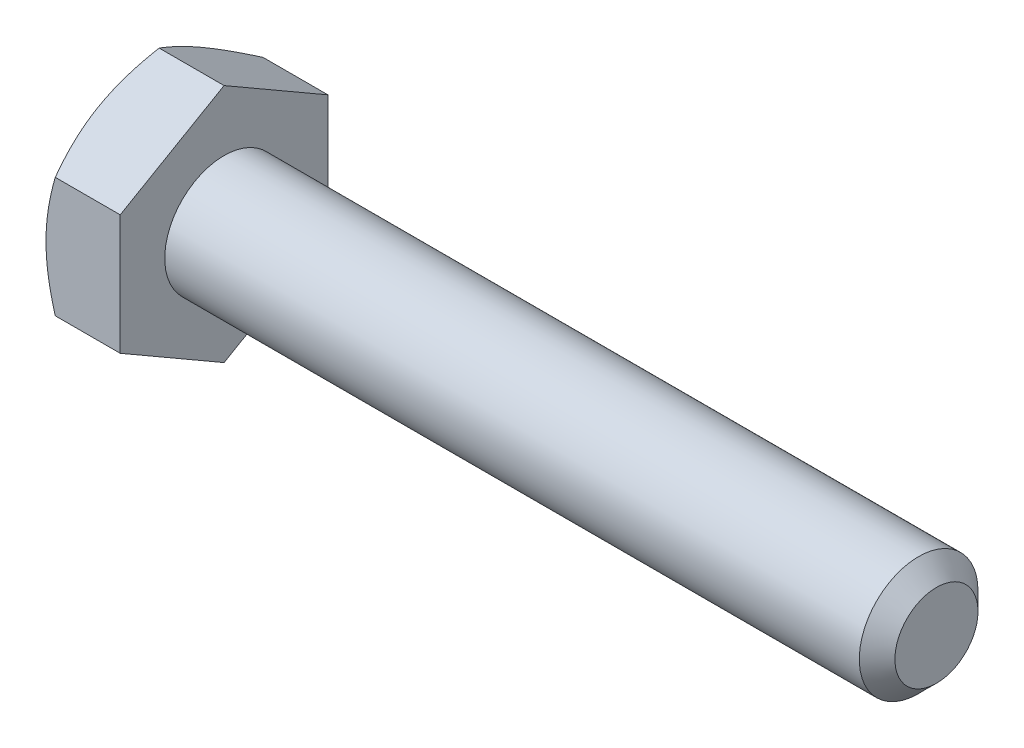
ISO-10303-21;
HEADER;
FILE_DESCRIPTION(('STEP AP214'),'2;1');
FILE_NAME('part.step','',(''),(''),'','','');
FILE_SCHEMA(('AUTOMOTIVE_DESIGN { 1 0 10303 214 1 1 1 1 }'));
ENDSEC;
DATA;
#1=APPLICATION_CONTEXT('core data for automotive mechanical design processes');
#2=APPLICATION_PROTOCOL_DEFINITION('international standard','automotive_design',2000,#1);
#3=PRODUCT_CONTEXT('',#1,'mechanical');
#4=PRODUCT('Part','Part','',(#3));
#5=PRODUCT_RELATED_PRODUCT_CATEGORY('part','',(#4));
#6=PRODUCT_DEFINITION_FORMATION('','',#4);
#7=PRODUCT_DEFINITION_CONTEXT('part definition',#1,'design');
#8=PRODUCT_DEFINITION('design','',#6,#7);
#9=PRODUCT_DEFINITION_SHAPE('','',#8);
#10=(LENGTH_UNIT() NAMED_UNIT(*) SI_UNIT(.MILLI.,.METRE.));
#11=(NAMED_UNIT(*) PLANE_ANGLE_UNIT() SI_UNIT($,.RADIAN.));
#12=(NAMED_UNIT(*) SI_UNIT($,.STERADIAN.) SOLID_ANGLE_UNIT());
#13=UNCERTAINTY_MEASURE_WITH_UNIT(LENGTH_MEASURE(1.E-05),#10,'distance_accuracy_value','');
#14=(GEOMETRIC_REPRESENTATION_CONTEXT(3) GLOBAL_UNCERTAINTY_ASSIGNED_CONTEXT((#13)) GLOBAL_UNIT_ASSIGNED_CONTEXT((#10,
#11,#12)) REPRESENTATION_CONTEXT('',''));
#15=CARTESIAN_POINT('',(0.,0.,0.));
#16=DIRECTION('',(0.,0.,1.));
#17=DIRECTION('',(1.,0.,0.));
#18=AXIS2_PLACEMENT_3D('',#15,#16,#17);
#19=CARTESIAN_POINT('',(-21.034375,-3.20790243318486,5.55625));
#20=DIRECTION('',(0.,0.,-1.));
#21=DIRECTION('',(0.,1.,0.));
#22=AXIS2_PLACEMENT_3D('',#19,#20,#21);
#23=PLANE('',#22);
#24=CARTESIAN_POINT('',(-18.2745843669925,-8.71597197874928,5.55625));
#25=CARTESIAN_POINT('',(-18.3931276134455,-8.47241296686081,5.55625));
#26=CARTESIAN_POINT('',(-18.5105624325106,-8.22830532002065,5.55625));
#27=CARTESIAN_POINT('',(-18.7425936359799,-7.73870131011008,5.55625));
#28=CARTESIAN_POINT('',(-18.8571895915108,-7.49320474401133,5.55625));
#29=CARTESIAN_POINT('',(-19.0834767997047,-6.99931388746861,5.55625));
#30=CARTESIAN_POINT('',(-19.1951496861504,-6.75091115377122,5.55625));
#31=CARTESIAN_POINT('',(-19.4140550680343,-6.25216399271396,5.55625));
#32=CARTESIAN_POINT('',(-19.5212877669676,-6.00181965496413,5.55625));
#33=CARTESIAN_POINT('',(-19.7336259632592,-5.49040404685734,5.55625));
#34=CARTESIAN_POINT('',(-19.8385413372932,-5.22925341692313,5.55625));
#35=CARTESIAN_POINT('',(-20.0406690406665,-4.70393363694384,5.55625));
#36=CARTESIAN_POINT('',(-20.1378805198239,-4.43976415741687,5.55625));
#37=CARTESIAN_POINT('',(-20.322121601985,-3.90845027150971,5.55625));
#38=CARTESIAN_POINT('',(-20.4091709710349,-3.64131278581567,5.55625));
#39=CARTESIAN_POINT('',(-20.5703596469694,-3.10320429735546,5.55625));
#40=CARTESIAN_POINT('',(-20.6445029151649,-2.83223449856134,5.55625));
#41=CARTESIAN_POINT('',(-20.7759992911479,-2.28781102521185,5.55625));
#42=CARTESIAN_POINT('',(-20.8334450300266,-2.01438008102813,5.55625));
#43=CARTESIAN_POINT('',(-20.9283467478451,-1.46397793148425,5.55625));
#44=CARTESIAN_POINT('',(-20.9658048504601,-1.18700710543778,5.55625));
#45=CARTESIAN_POINT('',(-21.004519215684,-0.77183967915967,5.55625));
#46=CARTESIAN_POINT('',(-21.014501938354,-0.634423748801413,5.55625));
#47=CARTESIAN_POINT('',(-21.0286468286742,-0.359297220791254,5.55625));
#48=CARTESIAN_POINT('',(-21.0328095453193,-0.221586652159766,5.55625));
#49=CARTESIAN_POINT('',(-21.0352100203321,0.0538978121001032,5.55625));
#50=CARTESIAN_POINT('',(-21.0334472582896,0.191671712228108,5.55625));
#51=CARTESIAN_POINT('',(-21.0240420123307,0.467008988572043,5.55625));
#52=CARTESIAN_POINT('',(-21.0163997515358,0.604572372578371,5.55625));
#53=CARTESIAN_POINT('',(-20.9913631708715,0.932168886546727,5.55625));
#54=CARTESIAN_POINT('',(-20.971346615147,1.12200607500774,5.55625));
#55=CARTESIAN_POINT('',(-20.9211855559147,1.50032750566802,5.55625));
#56=CARTESIAN_POINT('',(-20.8910397617237,1.68881157232281,5.55625));
#57=CARTESIAN_POINT('',(-20.7870024146897,2.25198169738515,5.55625));
#58=CARTESIAN_POINT('',(-20.6995274707725,2.6241947560597,5.55625));
#59=CARTESIAN_POINT('',(-20.5470938857469,3.18100797717286,5.55625));
#60=CARTESIAN_POINT('',(-20.491996347305,3.3684742193473,5.55625));
#61=CARTESIAN_POINT('',(-20.3758963006724,3.74158722888387,5.55625));
#62=CARTESIAN_POINT('',(-20.3148937479768,3.92723398252124,5.55625));
#63=CARTESIAN_POINT('',(-20.1879776325897,4.2967648956476,5.55625));
#64=CARTESIAN_POINT('',(-20.1220655075926,4.48064955347619,5.55625));
#65=CARTESIAN_POINT('',(-19.9861240596993,4.84688123577246,5.55625));
#66=CARTESIAN_POINT('',(-19.9160948245767,5.02922829292587,5.55625));
#67=CARTESIAN_POINT('',(-19.7251931773471,5.51260356628247,5.55625));
#68=CARTESIAN_POINT('',(-19.6013007551523,5.8124378410047,5.55625));
#69=CARTESIAN_POINT('',(-19.3464246065505,6.40908803513469,5.55625));
#70=CARTESIAN_POINT('',(-19.2154401468771,6.70590363865018,5.55625));
#71=CARTESIAN_POINT('',(-18.9480293545831,7.29719434259167,5.55625));
#72=CARTESIAN_POINT('',(-18.8116010743512,7.59166855933578,5.55624999999999));
#73=CARTESIAN_POINT('',(-18.5345811116466,8.17863206091545,5.55624999999999));
#74=CARTESIAN_POINT('',(-18.3939895864128,8.47112142020427,5.55624999999999));
#75=CARTESIAN_POINT('',(-18.109318147738,9.05495036819324,5.55624999999999));
#76=CARTESIAN_POINT('',(-17.9652332095448,9.34628750192602,5.55624999999999));
#77=CARTESIAN_POINT('',(-17.6744465475127,9.9276532853253,5.55624999999999));
#78=CARTESIAN_POINT('',(-17.5277448035253,10.2176819248953,5.55624999999999));
#79=CARTESIAN_POINT('',(-17.0845640177122,11.0860438246278,5.55624999999999));
#80=CARTESIAN_POINT('',(-16.7849489566421,11.6627758925917,5.55624999999999));
#81=CARTESIAN_POINT('',(-16.2112850053505,12.7539662387514,5.55624999999999));
#82=CARTESIAN_POINT('',(-15.9377850436465,13.2687144928819,5.55624999999999));
#83=CARTESIAN_POINT('',(-15.3874510158717,14.2964629870514,5.55624999999999));
#84=CARTESIAN_POINT('',(-15.1106167576174,14.8094631241242,5.55624999999999));
#85=CARTESIAN_POINT('',(-14.5553732577565,15.8324606524662,5.55624999999999));
#86=CARTESIAN_POINT('',(-14.2769720091832,16.3424623888781,5.55624999999999));
#87=CARTESIAN_POINT('',(-13.7182670469657,17.3613731639511,5.55624999999999));
#88=CARTESIAN_POINT('',(-13.4379634782856,17.8702822820683,5.55624999999999));
#89=CARTESIAN_POINT('',(-13.1569657879674,18.3788054223414,5.55624999999999));
#90=B_SPLINE_CURVE_WITH_KNOTS('',3,(#24,#25,#26,#27,#28,#29,#30,#31,#32,#33,#34,#35,#36,#37,#38,
#39,#40,#41,#42,#43,#44,#45,#46,#47,#48,#49,#50,#51,#52,#53,#54,#55,#56,#57,#58,#59,#60,#61,#62,
#63,#64,#65,#66,#67,#68,#69,#70,#71,#72,#73,#74,#75,#76,#77,#78,#79,#80,#81,#82,#83,#84,#85,#86,
#87,#88,#89),.UNSPECIFIED.,.F.,.F.,(4,2,2,2,2,2,2,2,2,2,2,2,2,2,2,2,2,2,2,2,2,2,2,2,2,2,2,2,2,2,
2,2,4),(0.,0.812635730373021,1.62539348788032,2.44240990684273,3.25938884015621,
4.10360649542401,4.94791718701091,5.79055726038603,6.63293824174536,7.47055271943839,
8.30807818332957,8.72130785168299,9.13449853788832,9.54772551385981,9.96093680902995,
10.5332843829937,11.1057049140379,12.2511183074305,12.8372525638741,13.4233912382427,
14.0093589404389,14.5953141547965,15.5684465267885,16.5416797066259,17.5152642537239,
18.4888120769129,19.4638547232904,20.4389048803864,22.3885945301673,24.1372706665326,
25.886048080782,27.6291677691576,29.3721560841402),.UNSPECIFIED.);
#91=CARTESIAN_POINT('',(-20.5381107665182,-3.20790243318486,5.55625));
#92=VERTEX_POINT('',#91);
#93=CARTESIAN_POINT('',(-21.034375,0.,5.55625));
#94=VERTEX_POINT('',#93);
#95=EDGE_CURVE('E280',#92,#94,#90,.T.);
#96=ORIENTED_EDGE('',*,*,#95,.F.);
#97=DIRECTION('',(1.,0.,0.));
#98=VECTOR('',#97,1.);
#99=CARTESIAN_POINT('',(-21.034375,-3.20790243318486,5.55625));
#100=LINE('',#99,#98);
#101=CARTESIAN_POINT('',(-17.065625,-3.20790243318486,5.55625));
#102=VERTEX_POINT('',#101);
#103=EDGE_CURVE('E283',#92,#102,#100,.T.);
#104=ORIENTED_EDGE('',*,*,#103,.T.);
#105=DIRECTION('',(0.,1.,0.));
#106=VECTOR('',#105,1.);
#107=CARTESIAN_POINT('',(-17.065625,-3.20790243318486,5.55625));
#108=LINE('',#107,#106);
#109=CARTESIAN_POINT('',(-17.065625,3.20790243318486,5.55625));
#110=VERTEX_POINT('',#109);
#111=EDGE_CURVE('E286',#102,#110,#108,.T.);
#112=ORIENTED_EDGE('',*,*,#111,.T.);
#113=DIRECTION('',(1.,0.,0.));
#114=VECTOR('',#113,1.);
#115=CARTESIAN_POINT('',(-21.034375,3.20790243318486,5.55625));
#116=LINE('',#115,#114);
#117=CARTESIAN_POINT('',(-20.5381107665182,3.20790243318486,5.55625));
#118=VERTEX_POINT('',#117);
#119=EDGE_CURVE('E242',#118,#110,#116,.T.);
#120=ORIENTED_EDGE('',*,*,#119,.F.);
#121=EDGE_CURVE('E119',#94,#118,#90,.T.);
#122=ORIENTED_EDGE('',*,*,#121,.F.);
#123=EDGE_LOOP('',(#96,#104,#112,#120,#122));
#124=FACE_BOUND('',#123,.T.);
#125=ADVANCED_FACE('F42',(#124),#23,.F.);
#126=CARTESIAN_POINT('',(-21.034375,3.20790243318486,5.55625));
#127=DIRECTION('',(0.,-0.866025403784438,-0.5));
#128=DIRECTION('',(0.,0.5,-0.866025403784439));
#129=AXIS2_PLACEMENT_3D('',#126,#127,#128);
#130=PLANE('',#129);
#131=CARTESIAN_POINT('',(-20.5380440980518,3.20778696313102,5.55645));
#132=CARTESIAN_POINT('',(-20.5787494396287,3.27830048099898,5.43431700443227));
#133=CARTESIAN_POINT('',(-20.6176074606368,3.34907690760433,5.31172863757364));
#134=CARTESIAN_POINT('',(-20.6911200665754,3.49120454378004,5.06555635055764));
#135=CARTESIAN_POINT('',(-20.7257728381981,3.56255598725623,4.94197202526351));
#136=CARTESIAN_POINT('',(-20.8227431144389,3.7777527611819,4.56924027919934));
#137=CARTESIAN_POINT('',(-20.877898945498,3.92244755263586,4.3186215488105));
#138=CARTESIAN_POINT('',(-20.942576095153,4.13898067940738,3.94357517172046));
#139=CARTESIAN_POINT('',(-20.9610008296374,4.21017202280888,3.82026814788997));
#140=CARTESIAN_POINT('',(-20.9918966337596,4.35287639627881,3.57309692257778));
#141=CARTESIAN_POINT('',(-21.004368229438,4.42438939736052,3.44923277130254));
#142=CARTESIAN_POINT('',(-21.0230399134017,4.56753961185542,3.20128932668298));
#143=CARTESIAN_POINT('',(-21.0292471193166,4.63917659144933,3.07721043832556));
#144=CARTESIAN_POINT('',(-21.0352635825862,4.7825127822332,2.82894487332451));
#145=CARTESIAN_POINT('',(-21.0350730375727,4.85421199143242,2.70475820012895));
#146=CARTESIAN_POINT('',(-21.0257567573071,5.05064720059277,2.36452243746779));
#147=CARTESIAN_POINT('',(-21.0101153403106,5.1753189069971,2.14858470770919));
#148=CARTESIAN_POINT('',(-20.9605150950254,5.42383425573453,1.71814349723526));
#149=CARTESIAN_POINT('',(-20.9265393117333,5.54767702400135,1.50364153044716));
#150=CARTESIAN_POINT('',(-20.8416092499519,5.79669255822861,1.07233397329164));
#151=CARTESIAN_POINT('',(-20.7902951119579,5.92183390122649,0.855582809091896));
#152=CARTESIAN_POINT('',(-20.6738325447076,6.17025031750736,0.425312954659246));
#153=CARTESIAN_POINT('',(-20.6087114741206,6.29352857247572,0.211788753585619));
#154=CARTESIAN_POINT('',(-20.5380440980518,6.41592033642355,-0.000200000000001761));
#155=B_SPLINE_CURVE_WITH_KNOTS('',3,(#131,#132,#133,#134,#135,#136,#137,#138,#139,#140,#141,
#142,#143,#144,#145,#146,#147,#148,#149,#150,#151,#152,#153,#154),.UNSPECIFIED.,.F.,.F.,(4,2,2,
2,2,2,2,2,2,2,2,4),(0.,0.440316908268041,0.880823012040822,1.76366572331169,2.19427472390783,
2.62484566732156,3.05492684132792,3.48499472977669,4.23370964386674,4.98311813377593,
5.74914806559356,6.51367405016872),.UNSPECIFIED.);
#156=CARTESIAN_POINT('',(-21.034375,4.81185364977729,2.778125));
#157=VERTEX_POINT('',#156);
#158=EDGE_CURVE('E115',#118,#157,#155,.T.);
#159=ORIENTED_EDGE('',*,*,#158,.F.);
#160=ORIENTED_EDGE('',*,*,#119,.T.);
#161=DIRECTION('',(0.,0.5,-0.866025403784438));
#162=VECTOR('',#161,1.);
#163=CARTESIAN_POINT('',(-17.065625,3.20790243318486,5.55625));
#164=LINE('',#163,#162);
#165=CARTESIAN_POINT('',(-17.065625,6.41580486636972,0.));
#166=VERTEX_POINT('',#165);
#167=EDGE_CURVE('E310',#110,#166,#164,.T.);
#168=ORIENTED_EDGE('',*,*,#167,.T.);
#169=DIRECTION('',(1.,0.,0.));
#170=VECTOR('',#169,1.);
#171=CARTESIAN_POINT('',(-21.034375,6.41580486636972,0.));
#172=LINE('',#171,#170);
#173=CARTESIAN_POINT('',(-20.5381107665182,6.41580486636972,0.));
#174=VERTEX_POINT('',#173);
#175=EDGE_CURVE('E140',#174,#166,#172,.T.);
#176=ORIENTED_EDGE('',*,*,#175,.F.);
#177=EDGE_CURVE('E124',#157,#174,#155,.T.);
#178=ORIENTED_EDGE('',*,*,#177,.F.);
#179=EDGE_LOOP('',(#159,#160,#168,#176,#178));
#180=FACE_BOUND('',#179,.T.);
#181=ADVANCED_FACE('F138',(#180),#130,.F.);
#182=CARTESIAN_POINT('',(-21.034375,6.41580486636972,0.));
#183=DIRECTION('',(0.,-0.866025403784439,0.5));
#184=DIRECTION('',(0.,-0.5,-0.866025403784439));
#185=AXIS2_PLACEMENT_3D('',#182,#183,#184);
#186=PLANE('',#185);
#187=CARTESIAN_POINT('',(-20.5380440980518,6.41592033642355,0.000199999999998725));
#188=CARTESIAN_POINT('',(-20.5787494396287,6.34540681855559,-0.121932995567732));
#189=CARTESIAN_POINT('',(-20.6176074606368,6.27463039195025,-0.244521362426354));
#190=CARTESIAN_POINT('',(-20.6911200665754,6.13250275577453,-0.490693649442357));
#191=CARTESIAN_POINT('',(-20.7257728381981,6.06115131229835,-0.614277974736489));
#192=CARTESIAN_POINT('',(-20.8227431144389,5.84595453837268,-0.987009720800664));
#193=CARTESIAN_POINT('',(-20.877898945498,5.70125974691872,-1.2376284511895));
#194=CARTESIAN_POINT('',(-20.942576095153,5.48472662014719,-1.61267482827954));
#195=CARTESIAN_POINT('',(-20.9610008296374,5.41353527674569,-1.73598185211002));
#196=CARTESIAN_POINT('',(-20.9918966337596,5.27083090327577,-1.98315307742222));
#197=CARTESIAN_POINT('',(-21.004368229438,5.19931790219406,-2.10701722869746));
#198=CARTESIAN_POINT('',(-21.0230399134017,5.05616768769916,-2.35496067331702));
#199=CARTESIAN_POINT('',(-21.0292471193166,4.98453070810525,-2.47903956167444));
#200=CARTESIAN_POINT('',(-21.0352635825862,4.84119451732138,-2.72730512667549));
#201=CARTESIAN_POINT('',(-21.0350730375727,4.76949530812216,-2.85149179987105));
#202=CARTESIAN_POINT('',(-21.0257567573071,4.5730600989618,-3.19172756253221));
#203=CARTESIAN_POINT('',(-21.0101153403106,4.44838839255747,-3.40766529229081));
#204=CARTESIAN_POINT('',(-20.9605150950254,4.19987304382004,-3.83810650276474));
#205=CARTESIAN_POINT('',(-20.9265393117333,4.07603027555323,-4.05260846955284));
#206=CARTESIAN_POINT('',(-20.8416092499519,3.82701474132597,-4.48391602670836));
#207=CARTESIAN_POINT('',(-20.7902951119579,3.70187339832808,-4.7006671909081));
#208=CARTESIAN_POINT('',(-20.6738325447076,3.45345698204721,-5.13093704534075));
#209=CARTESIAN_POINT('',(-20.6087114741206,3.33017872707885,-5.34446124641438));
#210=CARTESIAN_POINT('',(-20.5380440980518,3.20778696313102,-5.55645));
#211=B_SPLINE_CURVE_WITH_KNOTS('',3,(#187,#188,#189,#190,#191,#192,#193,#194,#195,#196,#197,
#198,#199,#200,#201,#202,#203,#204,#205,#206,#207,#208,#209,#210),.UNSPECIFIED.,.F.,.F.,(4,2,2,
2,2,2,2,2,2,2,2,4),(0.,0.440316908268041,0.880823012040822,1.76366572331169,2.19427472390783,
2.62484566732156,3.05492684132792,3.48499472977669,4.23370964386674,4.98311813377593,
5.74914806559356,6.51367405016872),.UNSPECIFIED.);
#212=CARTESIAN_POINT('',(-21.034375,4.81185364977729,-2.778125));
#213=VERTEX_POINT('',#212);
#214=EDGE_CURVE('E129',#174,#213,#211,.T.);
#215=ORIENTED_EDGE('',*,*,#214,.F.);
#216=ORIENTED_EDGE('',*,*,#175,.T.);
#217=DIRECTION('',(0.,-0.5,-0.866025403784439));
#218=VECTOR('',#217,1.);
#219=CARTESIAN_POINT('',(-17.065625,6.41580486636972,0.));
#220=LINE('',#219,#218);
#221=CARTESIAN_POINT('',(-17.065625,3.20790243318486,-5.55625));
#222=VERTEX_POINT('',#221);
#223=EDGE_CURVE('E307',#166,#222,#220,.T.);
#224=ORIENTED_EDGE('',*,*,#223,.T.);
#225=DIRECTION('',(1.,0.,0.));
#226=VECTOR('',#225,1.);
#227=CARTESIAN_POINT('',(-21.034375,3.20790243318486,-5.55625));
#228=LINE('',#227,#226);
#229=CARTESIAN_POINT('',(-20.5381107665182,3.20790243318486,-5.55625));
#230=VERTEX_POINT('',#229);
#231=EDGE_CURVE('E302',#230,#222,#228,.T.);
#232=ORIENTED_EDGE('',*,*,#231,.F.);
#233=EDGE_CURVE('E143',#213,#230,#211,.T.);
#234=ORIENTED_EDGE('',*,*,#233,.F.);
#235=EDGE_LOOP('',(#215,#216,#224,#232,#234));
#236=FACE_BOUND('',#235,.T.);
#237=ADVANCED_FACE('F204',(#236),#186,.F.);
#238=CARTESIAN_POINT('',(-21.034375,3.20790243318486,-5.55625));
#239=DIRECTION('',(0.,0.,1.));
#240=DIRECTION('',(0.,-1.,0.));
#241=AXIS2_PLACEMENT_3D('',#238,#239,#240);
#242=PLANE('',#241);
#243=CARTESIAN_POINT('',(-18.274584368384,-8.71597197589097,-5.55625));
#244=CARTESIAN_POINT('',(-18.393127614779,-8.4724129640987,-5.55625));
#245=CARTESIAN_POINT('',(-18.510562433786,-8.22830531735482,-5.55625));
#246=CARTESIAN_POINT('',(-18.7425936371397,-7.73870130763708,-5.55625));
#247=CARTESIAN_POINT('',(-18.8571895926128,-7.4932047416349,-5.55625));
#248=CARTESIAN_POINT('',(-19.0834768006911,-6.99931388528678,-5.55625));
#249=CARTESIAN_POINT('',(-19.1951496870791,-6.75091115168743,-5.55625));
#250=CARTESIAN_POINT('',(-19.4140550688484,-6.25216399082691,-5.55625));
#251=CARTESIAN_POINT('',(-19.5212877677249,-6.00181965317579,-5.55625));
#252=CARTESIAN_POINT('',(-19.7336259639013,-5.49040404527407,-5.55625));
#253=CARTESIAN_POINT('',(-19.838541337877,-5.22925341544629,-5.55625));
#254=CARTESIAN_POINT('',(-20.0406690411367,-4.70393363568157,-5.55625));
#255=CARTESIAN_POINT('',(-20.1378805202389,-4.43976415626273,-5.55625));
#256=CARTESIAN_POINT('',(-20.3221216022948,-3.90845027057386,-5.55625));
#257=CARTESIAN_POINT('',(-20.4091709712948,-3.64131278498994,-5.55625));
#258=CARTESIAN_POINT('',(-20.5703596471374,-3.103204296753,-5.55625));
#259=CARTESIAN_POINT('',(-20.644502915291,-2.83223449807201,-5.55625));
#260=CARTESIAN_POINT('',(-20.7759992911896,-2.28781102500664,-5.55625));
#261=CARTESIAN_POINT('',(-20.8334450300289,-2.01438008099472,-5.55625));
#262=CARTESIAN_POINT('',(-20.9283467477944,-1.46397793179866,-5.55625));
#263=CARTESIAN_POINT('',(-20.9658048503959,-1.18700710592821,-5.55625));
#264=CARTESIAN_POINT('',(-21.0045192156229,-0.771839679912929,-5.55625));
#265=CARTESIAN_POINT('',(-21.0145019382978,-0.634423749641011,-5.55625));
#266=CARTESIAN_POINT('',(-21.0286468286352,-0.359297221803361,-5.55625));
#267=CARTESIAN_POINT('',(-21.0328095452928,-0.221586653258043,-5.55625));
#268=CARTESIAN_POINT('',(-21.0352100203379,0.0538978108301058,-5.55625));
#269=CARTESIAN_POINT('',(-21.0334472583154,0.191671710872559,-5.55625));
#270=CARTESIAN_POINT('',(-21.0240420124033,0.467008987046523,-5.55625));
#271=CARTESIAN_POINT('',(-21.0163997516353,0.604572370968431,-5.55625));
#272=CARTESIAN_POINT('',(-20.9913631710371,0.932168884806747,-5.55625));
#273=CARTESIAN_POINT('',(-20.9713466153506,1.12200607322251,-5.55625));
#274=CARTESIAN_POINT('',(-20.9211855561963,1.50032750379435,-5.55625));
#275=CARTESIAN_POINT('',(-20.8910397620454,1.68881157040595,-5.55625));
#276=CARTESIAN_POINT('',(-20.7870024151322,2.25198169534108,-5.55625));
#277=CARTESIAN_POINT('',(-20.6995274712967,2.62419475393417,-5.55625));
#278=CARTESIAN_POINT('',(-20.5470938863917,3.18100797492548,-5.55625));
#279=CARTESIAN_POINT('',(-20.4919963479902,3.36847421705843,-5.55625));
#280=CARTESIAN_POINT('',(-20.3758963014373,3.74158722651249,-5.55625));
#281=CARTESIAN_POINT('',(-20.3148937487809,3.92723398010884,-5.55625));
#282=CARTESIAN_POINT('',(-20.1879776334707,4.29676489315346,-5.55625));
#283=CARTESIAN_POINT('',(-20.1220655085115,4.48064955094134,-5.55625));
#284=CARTESIAN_POINT('',(-19.9861240606925,4.84688123315617,-5.55625));
#285=CARTESIAN_POINT('',(-19.9160948256063,5.02922829026885,-5.55625));
#286=CARTESIAN_POINT('',(-19.7251931784386,5.51260356360176,-5.55625));
#287=CARTESIAN_POINT('',(-19.6013007562656,5.81243783833987,-5.55625));
#288=CARTESIAN_POINT('',(-19.3464246077012,6.4090880324996,-5.55625));
#289=CARTESIAN_POINT('',(-19.2154401480433,6.70590363602894,-5.55625));
#290=CARTESIAN_POINT('',(-18.9480293557759,7.29719433999666,-5.55625));
#291=CARTESIAN_POINT('',(-18.8116010755551,7.59166855675315,-5.55625));
#292=CARTESIAN_POINT('',(-18.5345811128693,8.17863205835625,-5.55625));
#293=CARTESIAN_POINT('',(-18.3939895876434,8.47112141765612,-5.55625));
#294=CARTESIAN_POINT('',(-18.1093181489817,9.05495036566683,-5.55625));
#295=CARTESIAN_POINT('',(-17.9652332107937,9.34628749941031,-5.55625));
#296=CARTESIAN_POINT('',(-17.6744465487701,9.92765328283016,-5.55625));
#297=CARTESIAN_POINT('',(-17.5277448047861,10.2176819224101,-5.55625));
#298=CARTESIAN_POINT('',(-17.0845640189813,11.086043822171,-5.55625));
#299=CARTESIAN_POINT('',(-16.7849489579141,11.6627758901527,-5.55625));
#300=CARTESIAN_POINT('',(-16.2112850066326,12.75396623633,-5.55625));
#301=CARTESIAN_POINT('',(-15.9377850449362,13.2687144904607,-5.55625));
#302=CARTESIAN_POINT('',(-15.3874510171751,14.2964629846299,-5.55625));
#303=CARTESIAN_POINT('',(-15.1106167589269,14.8094631217022,-5.55625));
#304=CARTESIAN_POINT('',(-14.5553732590784,15.8324606500401,-5.55625));
#305=CARTESIAN_POINT('',(-14.2769720105114,16.3424623864486,-5.55625));
#306=CARTESIAN_POINT('',(-13.7182670483059,17.3613731615141,-5.55625));
#307=CARTESIAN_POINT('',(-13.4379634796314,17.8702822796274,-5.55625));
#308=CARTESIAN_POINT('',(-13.1569657893186,18.3788054198964,-5.55625));
#309=B_SPLINE_CURVE_WITH_KNOTS('',3,(#243,#244,#245,#246,#247,#248,#249,#250,#251,#252,#253,
#254,#255,#256,#257,#258,#259,#260,#261,#262,#263,#264,#265,#266,#267,#268,#269,#270,#271,#272,
#273,#274,#275,#276,#277,#278,#279,#280,#281,#282,#283,#284,#285,#286,#287,#288,#289,#290,#291,
#292,#293,#294,#295,#296,#297,#298,#299,#300,#301,#302,#303,#304,#305,#306,#307,#308),
.UNSPECIFIED.,.F.,.F.,(4,2,2,2,2,2,2,2,2,2,2,2,2,2,2,2,2,2,2,2,2,2,2,2,2,2,2,2,2,2,2,2,4),(0.,
0.812635730037298,1.62539348720883,2.44240990583192,3.25938883880611,4.10360649371243,
4.94791718493774,5.79055725795246,6.63293823895168,7.4705527161171,8.30807817948146,
8.7213078475778,9.13449853352613,9.54772550924045,9.96093680415345,10.5332843779703,
11.1057049088676,12.2511183019659,12.8372525582557,13.4233912324707,14.0093589345136,
14.5953141487179,15.5684465207287,16.5416797005853,17.5152642477029,18.4888120709116,
19.4638547173109,20.4389048744288,22.3885945242527,24.1372706606078,25.8860480748471,
27.6291677632044,29.3721560781684),.UNSPECIFIED.);
#310=CARTESIAN_POINT('',(-21.034375,0.,-5.55625));
#311=VERTEX_POINT('',#310);
#312=EDGE_CURVE('E198',#230,#311,#309,.F.);
#313=ORIENTED_EDGE('',*,*,#312,.F.);
#314=ORIENTED_EDGE('',*,*,#231,.T.);
#315=DIRECTION('',(0.,-1.,0.));
#316=VECTOR('',#315,1.);
#317=CARTESIAN_POINT('',(-17.065625,3.20790243318486,-5.55625));
#318=LINE('',#317,#316);
#319=CARTESIAN_POINT('',(-17.065625,-3.20790243318486,-5.55625));
#320=VERTEX_POINT('',#319);
#321=EDGE_CURVE('E315',#222,#320,#318,.T.);
#322=ORIENTED_EDGE('',*,*,#321,.T.);
#323=DIRECTION('',(1.,0.,0.));
#324=VECTOR('',#323,1.);
#325=CARTESIAN_POINT('',(-21.034375,-3.20790243318486,-5.55625));
#326=LINE('',#325,#324);
#327=CARTESIAN_POINT('',(-20.5381107665182,-3.20790243318486,-5.55625));
#328=VERTEX_POINT('',#327);
#329=EDGE_CURVE('E264',#328,#320,#326,.T.);
#330=ORIENTED_EDGE('',*,*,#329,.F.);
#331=EDGE_CURVE('E191',#311,#328,#309,.F.);
#332=ORIENTED_EDGE('',*,*,#331,.F.);
#333=EDGE_LOOP('',(#313,#314,#322,#330,#332));
#334=FACE_BOUND('',#333,.T.);
#335=ADVANCED_FACE('F200',(#334),#242,.F.);
#336=CARTESIAN_POINT('',(-21.034375,-3.20790243318486,-5.55625));
#337=DIRECTION('',(0.,0.866025403784439,0.5));
#338=DIRECTION('',(0.,-0.5,0.866025403784439));
#339=AXIS2_PLACEMENT_3D('',#336,#337,#338);
#340=PLANE('',#339);
#341=CARTESIAN_POINT('',(-20.5380440980518,-3.20778696313102,-5.55645));
#342=CARTESIAN_POINT('',(-20.5787494396287,-3.27830048099898,-5.43431700443227));
#343=CARTESIAN_POINT('',(-20.6176074606368,-3.34907690760433,-5.31172863757364));
#344=CARTESIAN_POINT('',(-20.6911200665754,-3.49120454378004,-5.06555635055764));
#345=CARTESIAN_POINT('',(-20.7257728381981,-3.56255598725623,-4.94197202526351));
#346=CARTESIAN_POINT('',(-20.8227431144389,-3.7777527611819,-4.56924027919934));
#347=CARTESIAN_POINT('',(-20.877898945498,-3.92244755263586,-4.3186215488105));
#348=CARTESIAN_POINT('',(-20.942576095153,-4.13898067940738,-3.94357517172046));
#349=CARTESIAN_POINT('',(-20.9610008296374,-4.21017202280888,-3.82026814788997));
#350=CARTESIAN_POINT('',(-20.9918966337596,-4.35287639627881,-3.57309692257778));
#351=CARTESIAN_POINT('',(-21.004368229438,-4.42438939736051,-3.44923277130254));
#352=CARTESIAN_POINT('',(-21.0230399134017,-4.56753961185542,-3.20128932668298));
#353=CARTESIAN_POINT('',(-21.0292471193166,-4.63917659144933,-3.07721043832556));
#354=CARTESIAN_POINT('',(-21.0352635825862,-4.7825127822332,-2.82894487332451));
#355=CARTESIAN_POINT('',(-21.0350730375727,-4.85421199143242,-2.70475820012895));
#356=CARTESIAN_POINT('',(-21.0257567573071,-5.05064720059277,-2.36452243746779));
#357=CARTESIAN_POINT('',(-21.0101153403106,-5.1753189069971,-2.14858470770919));
#358=CARTESIAN_POINT('',(-20.9605150950254,-5.42383425573453,-1.71814349723526));
#359=CARTESIAN_POINT('',(-20.9265393117333,-5.54767702400135,-1.50364153044716));
#360=CARTESIAN_POINT('',(-20.8416092499519,-5.7966925582286,-1.07233397329164));
#361=CARTESIAN_POINT('',(-20.7902951119579,-5.92183390122649,-0.855582809091897));
#362=CARTESIAN_POINT('',(-20.6738325447076,-6.17025031750736,-0.425312954659247));
#363=CARTESIAN_POINT('',(-20.6087114741206,-6.29352857247572,-0.21178875358562));
#364=CARTESIAN_POINT('',(-20.5380440980518,-6.41592033642355,0.000200000000000885));
#365=B_SPLINE_CURVE_WITH_KNOTS('',3,(#341,#342,#343,#344,#345,#346,#347,#348,#349,#350,#351,
#352,#353,#354,#355,#356,#357,#358,#359,#360,#361,#362,#363,#364),.UNSPECIFIED.,.F.,.F.,(4,2,2,
2,2,2,2,2,2,2,2,4),(0.,0.440316908268042,0.880823012040824,1.76366572331169,2.19427472390783,
2.62484566732156,3.05492684132792,3.48499472977669,4.23370964386675,4.98311813377593,
5.74914806559356,6.51367405016872),.UNSPECIFIED.);
#366=CARTESIAN_POINT('',(-21.034375,-4.81185364977729,-2.778125));
#367=VERTEX_POINT('',#366);
#368=EDGE_CURVE('E199',#328,#367,#365,.T.);
#369=ORIENTED_EDGE('',*,*,#368,.F.);
#370=ORIENTED_EDGE('',*,*,#329,.T.);
#371=DIRECTION('',(0.,-0.5,0.866025403784439));
#372=VECTOR('',#371,1.);
#373=CARTESIAN_POINT('',(-17.065625,-3.20790243318486,-5.55625));
#374=LINE('',#373,#372);
#375=CARTESIAN_POINT('',(-17.065625,-6.41580486636971,0.));
#376=VERTEX_POINT('',#375);
#377=EDGE_CURVE('E296',#320,#376,#374,.T.);
#378=ORIENTED_EDGE('',*,*,#377,.T.);
#379=DIRECTION('',(1.,0.,0.));
#380=VECTOR('',#379,1.);
#381=CARTESIAN_POINT('',(-21.034375,-6.41580486636971,0.));
#382=LINE('',#381,#380);
#383=CARTESIAN_POINT('',(-20.5381107665182,-6.41580486636971,0.));
#384=VERTEX_POINT('',#383);
#385=EDGE_CURVE('E291',#384,#376,#382,.T.);
#386=ORIENTED_EDGE('',*,*,#385,.F.);
#387=EDGE_CURVE('E185',#367,#384,#365,.T.);
#388=ORIENTED_EDGE('',*,*,#387,.F.);
#389=EDGE_LOOP('',(#369,#370,#378,#386,#388));
#390=FACE_BOUND('',#389,.T.);
#391=ADVANCED_FACE('F203',(#390),#340,.F.);
#392=CARTESIAN_POINT('',(-21.034375,-6.41580486636971,0.));
#393=DIRECTION('',(0.,0.866025403784439,-0.5));
#394=DIRECTION('',(0.,0.5,0.866025403784439));
#395=AXIS2_PLACEMENT_3D('',#392,#393,#394);
#396=PLANE('',#395);
#397=CARTESIAN_POINT('',(-20.5380440980518,-6.41592033642355,-0.000199999999998803));
#398=CARTESIAN_POINT('',(-20.5787494396287,-6.34540681855559,0.121932995567732));
#399=CARTESIAN_POINT('',(-20.6176074606368,-6.27463039195025,0.244521362426354));
#400=CARTESIAN_POINT('',(-20.6911200665754,-6.13250275577453,0.490693649442357));
#401=CARTESIAN_POINT('',(-20.7257728381981,-6.06115131229835,0.614277974736488));
#402=CARTESIAN_POINT('',(-20.8227431144389,-5.84595453837268,0.987009720800663));
#403=CARTESIAN_POINT('',(-20.877898945498,-5.70125974691872,1.2376284511895));
#404=CARTESIAN_POINT('',(-20.942576095153,-5.48472662014719,1.61267482827954));
#405=CARTESIAN_POINT('',(-20.9610008296374,-5.41353527674569,1.73598185211002));
#406=CARTESIAN_POINT('',(-20.9918966337596,-5.27083090327577,1.98315307742222));
#407=CARTESIAN_POINT('',(-21.004368229438,-5.19931790219406,2.10701722869746));
#408=CARTESIAN_POINT('',(-21.0230399134017,-5.05616768769915,2.35496067331702));
#409=CARTESIAN_POINT('',(-21.0292471193166,-4.98453070810525,2.47903956167444));
#410=CARTESIAN_POINT('',(-21.0352635825862,-4.84119451732138,2.72730512667549));
#411=CARTESIAN_POINT('',(-21.0350730375727,-4.76949530812216,2.85149179987105));
#412=CARTESIAN_POINT('',(-21.0257567573071,-4.5730600989618,3.19172756253221));
#413=CARTESIAN_POINT('',(-21.0101153403106,-4.44838839255747,3.40766529229081));
#414=CARTESIAN_POINT('',(-20.9605150950254,-4.19987304382004,3.83810650276474));
#415=CARTESIAN_POINT('',(-20.9265393117333,-4.07603027555323,4.05260846955284));
#416=CARTESIAN_POINT('',(-20.8416092499519,-3.82701474132597,4.48391602670836));
#417=CARTESIAN_POINT('',(-20.7902951119579,-3.70187339832808,4.7006671909081));
#418=CARTESIAN_POINT('',(-20.6738325447076,-3.45345698204721,5.13093704534075));
#419=CARTESIAN_POINT('',(-20.6087114741206,-3.33017872707885,5.34446124641438));
#420=CARTESIAN_POINT('',(-20.5380440980518,-3.20778696313102,5.55645));
#421=B_SPLINE_CURVE_WITH_KNOTS('',3,(#397,#398,#399,#400,#401,#402,#403,#404,#405,#406,#407,
#408,#409,#410,#411,#412,#413,#414,#415,#416,#417,#418,#419,#420),.UNSPECIFIED.,.F.,.F.,(4,2,2,
2,2,2,2,2,2,2,2,4),(0.,0.440316908268041,0.880823012040822,1.76366572331169,2.19427472390783,
2.62484566732156,3.05492684132792,3.48499472977669,4.23370964386674,4.98311813377593,
5.74914806559356,6.51367405016872),.UNSPECIFIED.);
#422=CARTESIAN_POINT('',(-21.034375,-4.81185364977729,2.778125));
#423=VERTEX_POINT('',#422);
#424=EDGE_CURVE('E273',#384,#423,#421,.T.);
#425=ORIENTED_EDGE('',*,*,#424,.F.);
#426=ORIENTED_EDGE('',*,*,#385,.T.);
#427=DIRECTION('',(0.,0.5,0.866025403784439));
#428=VECTOR('',#427,1.);
#429=CARTESIAN_POINT('',(-17.065625,-6.41580486636971,0.));
#430=LINE('',#429,#428);
#431=EDGE_CURVE('E288',#376,#102,#430,.T.);
#432=ORIENTED_EDGE('',*,*,#431,.T.);
#433=ORIENTED_EDGE('',*,*,#103,.F.);
#434=EDGE_CURVE('E135',#423,#92,#421,.T.);
#435=ORIENTED_EDGE('',*,*,#434,.F.);
#436=EDGE_LOOP('',(#425,#426,#432,#433,#435));
#437=FACE_BOUND('',#436,.T.);
#438=ADVANCED_FACE('F226',(#437),#396,.F.);
#439=CARTESIAN_POINT('',(-17.065625,0.,0.));
#440=DIRECTION('',(1.,0.,0.));
#441=DIRECTION('',(0.,0.,-1.));
#442=AXIS2_PLACEMENT_3D('',#439,#440,#441);
#443=CYLINDRICAL_SURFACE('',#442,3.175);
#444=CARTESIAN_POINT('',(20.081875,0.,0.));
#445=DIRECTION('',(1.,0.,0.));
#446=DIRECTION('',(0.,0.,-1.));
#447=AXIS2_PLACEMENT_3D('',#444,#445,#446);
#448=CIRCLE('',#447,3.175);
#449=CARTESIAN_POINT('',(20.081875,0.,-3.175));
#450=VERTEX_POINT('',#449);
#451=EDGE_CURVE('E235',#450,#450,#448,.F.);
#452=CARTESIAN_POINT('',(-17.065625,0.,0.));
#453=DIRECTION('',(-1.,0.,0.));
#454=DIRECTION('',(0.,0.,1.));
#455=AXIS2_PLACEMENT_3D('',#452,#453,#454);
#456=CIRCLE('',#455,3.175);
#457=CARTESIAN_POINT('',(-17.065625,0.,-3.175));
#458=VERTEX_POINT('',#457);
#459=EDGE_CURVE('E238',#458,#458,#456,.F.);
#460=CARTESIAN_POINT('',(20.081875,0.,-3.175));
#461=CARTESIAN_POINT('',(19.694921875,0.,-3.175));
#462=CARTESIAN_POINT('',(19.30796875,0.,-3.175));
#463=CARTESIAN_POINT('',(18.5340625,0.,-3.175));
#464=CARTESIAN_POINT('',(18.147109375,0.,-3.175));
#465=CARTESIAN_POINT('',(17.373203125,0.,-3.175));
#466=CARTESIAN_POINT('',(16.98625,0.,-3.175));
#467=CARTESIAN_POINT('',(16.21234375,0.,-3.175));
#468=CARTESIAN_POINT('',(15.825390625,0.,-3.175));
#469=CARTESIAN_POINT('',(15.051484375,0.,-3.175));
#470=CARTESIAN_POINT('',(14.66453125,0.,-3.175));
#471=CARTESIAN_POINT('',(13.890625,0.,-3.175));
#472=CARTESIAN_POINT('',(13.503671875,0.,-3.175));
#473=CARTESIAN_POINT('',(12.729765625,0.,-3.175));
#474=CARTESIAN_POINT('',(12.3428125,0.,-3.175));
#475=CARTESIAN_POINT('',(11.56890625,0.,-3.175));
#476=CARTESIAN_POINT('',(11.181953125,0.,-3.175));
#477=CARTESIAN_POINT('',(10.408046875,0.,-3.175));
#478=CARTESIAN_POINT('',(10.02109375,0.,-3.175));
#479=CARTESIAN_POINT('',(9.24718750000001,0.,-3.175));
#480=CARTESIAN_POINT('',(8.86023437500001,0.,-3.175));
#481=CARTESIAN_POINT('',(8.086328125,0.,-3.175));
#482=CARTESIAN_POINT('',(7.69937500000001,0.,-3.175));
#483=CARTESIAN_POINT('',(6.92546875,0.,-3.175));
#484=CARTESIAN_POINT('',(6.538515625,0.,-3.175));
#485=CARTESIAN_POINT('',(5.764609375,0.,-3.175));
#486=CARTESIAN_POINT('',(5.37765625,0.,-3.175));
#487=CARTESIAN_POINT('',(4.60375,0.,-3.175));
#488=CARTESIAN_POINT('',(4.216796875,0.,-3.175));
#489=CARTESIAN_POINT('',(3.442890625,0.,-3.175));
#490=CARTESIAN_POINT('',(3.0559375,0.,-3.175));
#491=CARTESIAN_POINT('',(2.28203125,0.,-3.175));
#492=CARTESIAN_POINT('',(1.895078125,0.,-3.175));
#493=CARTESIAN_POINT('',(1.121171875,0.,-3.175));
#494=CARTESIAN_POINT('',(0.734218750000002,0.,-3.175));
#495=CARTESIAN_POINT('',(-0.0396874999999975,0.,-3.175));
#496=CARTESIAN_POINT('',(-0.426640624999998,0.,-3.175));
#497=CARTESIAN_POINT('',(-1.200546875,0.,-3.175));
#498=CARTESIAN_POINT('',(-1.5875,0.,-3.175));
#499=CARTESIAN_POINT('',(-2.36140625,0.,-3.175));
#500=CARTESIAN_POINT('',(-2.748359375,0.,-3.175));
#501=CARTESIAN_POINT('',(-3.522265625,0.,-3.175));
#502=CARTESIAN_POINT('',(-3.90921875,0.,-3.175));
#503=CARTESIAN_POINT('',(-4.683125,0.,-3.175));
#504=CARTESIAN_POINT('',(-5.070078125,0.,-3.175));
#505=CARTESIAN_POINT('',(-5.843984375,0.,-3.175));
#506=CARTESIAN_POINT('',(-6.2309375,0.,-3.175));
#507=CARTESIAN_POINT('',(-7.00484375,0.,-3.175));
#508=CARTESIAN_POINT('',(-7.391796875,0.,-3.175));
#509=CARTESIAN_POINT('',(-8.165703125,0.,-3.175));
#510=CARTESIAN_POINT('',(-8.55265625,0.,-3.175));
#511=CARTESIAN_POINT('',(-9.3265625,0.,-3.175));
#512=CARTESIAN_POINT('',(-9.713515625,0.,-3.175));
#513=CARTESIAN_POINT('',(-10.487421875,0.,-3.175));
#514=CARTESIAN_POINT('',(-10.874375,0.,-3.175));
#515=CARTESIAN_POINT('',(-11.64828125,0.,-3.175));
#516=CARTESIAN_POINT('',(-12.035234375,0.,-3.175));
#517=CARTESIAN_POINT('',(-12.809140625,0.,-3.175));
#518=CARTESIAN_POINT('',(-13.19609375,0.,-3.175));
#519=CARTESIAN_POINT('',(-13.97,0.,-3.175));
#520=CARTESIAN_POINT('',(-14.356953125,0.,-3.175));
#521=CARTESIAN_POINT('',(-15.130859375,0.,-3.175));
#522=CARTESIAN_POINT('',(-15.5178125,0.,-3.175));
#523=CARTESIAN_POINT('',(-16.29171875,0.,-3.175));
#524=CARTESIAN_POINT('',(-16.678671875,0.,-3.175));
#525=CARTESIAN_POINT('',(-17.065625,0.,-3.175));
#526=B_SPLINE_CURVE_WITH_KNOTS('',3,(#460,#461,#462,#463,#464,#465,#466,#467,#468,#469,#470,
#471,#472,#473,#474,#475,#476,#477,#478,#479,#480,#481,#482,#483,#484,#485,#486,#487,#488,#489,
#490,#491,#492,#493,#494,#495,#496,#497,#498,#499,#500,#501,#502,#503,#504,#505,#506,#507,#508,
#509,#510,#511,#512,#513,#514,#515,#516,#517,#518,#519,#520,#521,#522,#523,#524,#525),
.UNSPECIFIED.,.F.,.F.,(4,2,2,2,2,2,2,2,2,2,2,2,2,2,2,2,2,2,2,2,2,2,2,2,2,2,2,2,2,2,2,2,4),(0.,
1.160859375,2.32171875,3.482578125,4.6434375,5.804296875,6.96515625,8.126015625,9.286875,
10.447734375,11.60859375,12.769453125,13.9303125,15.091171875,16.25203125,17.412890625,18.57375,
19.734609375,20.89546875,22.056328125,23.2171875,24.378046875,25.53890625,26.699765625,
27.860625,29.021484375,30.18234375,31.343203125,32.5040625,33.664921875,34.82578125,
35.986640625,37.1475),.UNSPECIFIED.);
#527=EDGE_CURVE('BSEAM223',#450,#458,#526,.T.);
#528=ORIENTED_EDGE('',*,*,#451,.T.);
#529=ORIENTED_EDGE('',*,*,#459,.T.);
#530=ORIENTED_EDGE('',*,*,#527,.T.);
#531=ORIENTED_EDGE('',*,*,#527,.F.);
#532=EDGE_LOOP('',(#528,#530,#529,#531));
#533=FACE_BOUND('',#532,.T.);
#534=ADVANCED_FACE('F223',(#533),#443,.T.);
#535=CARTESIAN_POINT('',(21.034375,0.,0.));
#536=DIRECTION('',(1.,0.,0.));
#537=DIRECTION('',(0.,0.,-1.));
#538=AXIS2_PLACEMENT_3D('',#535,#536,#537);
#539=PLANE('',#538);
#540=CARTESIAN_POINT('',(21.034375,0.,0.));
#541=DIRECTION('',(1.,0.,0.));
#542=DIRECTION('',(0.,0.,-1.));
#543=AXIS2_PLACEMENT_3D('',#540,#541,#542);
#544=CIRCLE('',#543,2.2225);
#545=CARTESIAN_POINT('',(21.034375,0.,-2.2225));
#546=VERTEX_POINT('',#545);
#547=EDGE_CURVE('E241',#546,#546,#544,.T.);
#548=ORIENTED_EDGE('',*,*,#547,.T.);
#549=EDGE_LOOP('',(#548));
#550=FACE_BOUND('',#549,.T.);
#551=ADVANCED_FACE('F221',(#550),#539,.T.);
#552=CARTESIAN_POINT('',(21.034375,0.,0.));
#553=DIRECTION('',(-1.,0.,0.));
#554=DIRECTION('',(0.,0.,1.));
#555=AXIS2_PLACEMENT_3D('',#552,#553,#554);
#556=CONICAL_SURFACE('',#555,2.2225,0.785398163397454);
#557=ORIENTED_EDGE('',*,*,#451,.F.);
#558=EDGE_LOOP('',(#557));
#559=FACE_BOUND('',#558,.T.);
#560=ORIENTED_EDGE('',*,*,#547,.F.);
#561=EDGE_LOOP('',(#560));
#562=FACE_BOUND('',#561,.T.);
#563=ADVANCED_FACE('F44',(#559,#562),#556,.T.);
#564=CARTESIAN_POINT('',(-17.065625,3.20790243318486,5.55625));
#565=DIRECTION('',(-1.,0.,0.));
#566=DIRECTION('',(0.,0.,1.));
#567=AXIS2_PLACEMENT_3D('',#564,#565,#566);
#568=PLANE('',#567);
#569=ORIENTED_EDGE('',*,*,#459,.F.);
#570=EDGE_LOOP('',(#569));
#571=FACE_BOUND('',#570,.T.);
#572=ORIENTED_EDGE('',*,*,#111,.F.);
#573=ORIENTED_EDGE('',*,*,#431,.F.);
#574=ORIENTED_EDGE('',*,*,#377,.F.);
#575=ORIENTED_EDGE('',*,*,#321,.F.);
#576=ORIENTED_EDGE('',*,*,#223,.F.);
#577=ORIENTED_EDGE('',*,*,#167,.F.);
#578=EDGE_LOOP('',(#572,#573,#574,#575,#576,#577));
#579=FACE_BOUND('',#578,.T.);
#580=ADVANCED_FACE('F170',(#571,#579),#568,.F.);
#581=CARTESIAN_POINT('',(-21.034375,0.,0.));
#582=DIRECTION('',(1.,0.,0.));
#583=DIRECTION('',(0.,0.,1.));
#584=AXIS2_PLACEMENT_3D('',#581,#582,#583);
#585=CONICAL_SURFACE('',#584,5.55625,1.0471975511966);
#586=ORIENTED_EDGE('',*,*,#95,.T.);
#587=CARTESIAN_POINT('',(-21.034375,0.,0.));
#588=DIRECTION('',(-1.,0.,0.));
#589=DIRECTION('',(0.,0.,1.));
#590=AXIS2_PLACEMENT_3D('',#587,#588,#589);
#591=CIRCLE('',#590,5.55625);
#592=EDGE_CURVE('E46',#423,#94,#591,.T.);
#593=ORIENTED_EDGE('',*,*,#592,.F.);
#594=ORIENTED_EDGE('',*,*,#434,.T.);
#595=EDGE_LOOP('',(#586,#593,#594));
#596=FACE_BOUND('',#595,.T.);
#597=ADVANCED_FACE('F165',(#596),#585,.T.);
#598=ORIENTED_EDGE('',*,*,#387,.T.);
#599=ORIENTED_EDGE('',*,*,#424,.T.);
#600=EDGE_CURVE('E67',#367,#423,#591,.T.);
#601=ORIENTED_EDGE('',*,*,#600,.F.);
#602=EDGE_LOOP('',(#598,#599,#601));
#603=FACE_BOUND('',#602,.T.);
#604=ADVANCED_FACE('F169',(#603),#585,.T.);
#605=ORIENTED_EDGE('',*,*,#331,.T.);
#606=ORIENTED_EDGE('',*,*,#368,.T.);
#607=EDGE_CURVE('E253',#311,#367,#591,.T.);
#608=ORIENTED_EDGE('',*,*,#607,.F.);
#609=EDGE_LOOP('',(#605,#606,#608));
#610=FACE_BOUND('',#609,.T.);
#611=ADVANCED_FACE('F267',(#610),#585,.T.);
#612=ORIENTED_EDGE('',*,*,#233,.T.);
#613=ORIENTED_EDGE('',*,*,#312,.T.);
#614=EDGE_CURVE('E52',#213,#311,#591,.T.);
#615=ORIENTED_EDGE('',*,*,#614,.F.);
#616=EDGE_LOOP('',(#612,#613,#615));
#617=FACE_BOUND('',#616,.T.);
#618=ADVANCED_FACE('F325',(#617),#585,.T.);
#619=ORIENTED_EDGE('',*,*,#177,.T.);
#620=ORIENTED_EDGE('',*,*,#214,.T.);
#621=EDGE_CURVE('E12',#157,#213,#591,.T.);
#622=ORIENTED_EDGE('',*,*,#621,.F.);
#623=EDGE_LOOP('',(#619,#620,#622));
#624=FACE_BOUND('',#623,.T.);
#625=ADVANCED_FACE('F127',(#624),#585,.T.);
#626=ORIENTED_EDGE('',*,*,#121,.T.);
#627=ORIENTED_EDGE('',*,*,#158,.T.);
#628=CARTESIAN_POINT('',(-21.034375,0.,0.));
#629=DIRECTION('',(-1.,0.,0.));
#630=DIRECTION('',(0.,0.,1.));
#631=AXIS2_PLACEMENT_3D('',#628,#629,#630);
#632=CIRCLE('',#631,5.55625);
#633=EDGE_CURVE('E59',#94,#157,#632,.T.);
#634=ORIENTED_EDGE('',*,*,#633,.F.);
#635=EDGE_LOOP('',(#626,#627,#634));
#636=FACE_BOUND('',#635,.T.);
#637=ADVANCED_FACE('F117',(#636),#585,.T.);
#638=CARTESIAN_POINT('',(-21.034375,3.20790243318486,5.55625));
#639=DIRECTION('',(-1.,0.,0.));
#640=DIRECTION('',(0.,0.,1.));
#641=AXIS2_PLACEMENT_3D('',#638,#639,#640);
#642=PLANE('',#641);
#643=ORIENTED_EDGE('',*,*,#592,.T.);
#644=ORIENTED_EDGE('',*,*,#633,.T.);
#645=ORIENTED_EDGE('',*,*,#621,.T.);
#646=ORIENTED_EDGE('',*,*,#614,.T.);
#647=ORIENTED_EDGE('',*,*,#607,.T.);
#648=ORIENTED_EDGE('',*,*,#600,.T.);
#649=EDGE_LOOP('',(#643,#644,#645,#646,#647,#648));
#650=FACE_BOUND('',#649,.T.);
#651=ADVANCED_FACE('F133',(#650),#642,.T.);
#652=CLOSED_SHELL('',(#125,#181,#237,#335,#391,#438,#534,#551,#563,#580,#597,#604,#611,#618,
#625,#637,#651));
#653=MANIFOLD_SOLID_BREP('B2',#652);
#654=ADVANCED_BREP_SHAPE_REPRESENTATION('',(#18,#653),#14);
#655=SHAPE_DEFINITION_REPRESENTATION(#9,#654);
ENDSEC;
END-ISO-10303-21;
